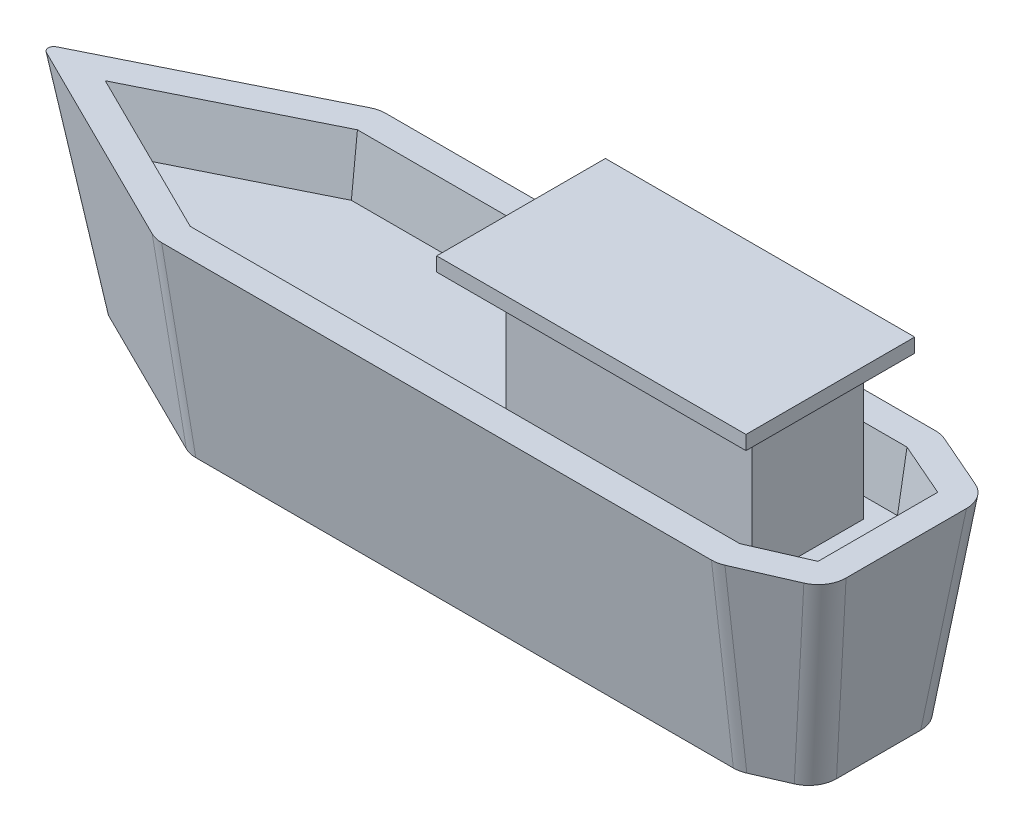
ISO-10303-21;
HEADER;
FILE_DESCRIPTION(('STEP AP214'),'2;1');
FILE_NAME('part.step','',(''),(''),'','','');
FILE_SCHEMA(('AUTOMOTIVE_DESIGN { 1 0 10303 214 1 1 1 1 }'));
ENDSEC;
DATA;
#1=APPLICATION_CONTEXT('core data for automotive mechanical design processes');
#2=APPLICATION_PROTOCOL_DEFINITION('international standard','automotive_design',2000,#1);
#3=PRODUCT_CONTEXT('',#1,'mechanical');
#4=PRODUCT('Part','Part','',(#3));
#5=PRODUCT_RELATED_PRODUCT_CATEGORY('part','',(#4));
#6=PRODUCT_DEFINITION_FORMATION('','',#4);
#7=PRODUCT_DEFINITION_CONTEXT('part definition',#1,'design');
#8=PRODUCT_DEFINITION('design','',#6,#7);
#9=PRODUCT_DEFINITION_SHAPE('','',#8);
#10=(LENGTH_UNIT() NAMED_UNIT(*) SI_UNIT(.MILLI.,.METRE.));
#11=(NAMED_UNIT(*) PLANE_ANGLE_UNIT() SI_UNIT($,.RADIAN.));
#12=(NAMED_UNIT(*) SI_UNIT($,.STERADIAN.) SOLID_ANGLE_UNIT());
#13=UNCERTAINTY_MEASURE_WITH_UNIT(LENGTH_MEASURE(1.E-05),#10,'distance_accuracy_value','');
#14=(GEOMETRIC_REPRESENTATION_CONTEXT(3) GLOBAL_UNCERTAINTY_ASSIGNED_CONTEXT((#13)) GLOBAL_UNIT_ASSIGNED_CONTEXT((#10,
#11,#12)) REPRESENTATION_CONTEXT('',''));
#15=CARTESIAN_POINT('',(0.,0.,0.));
#16=DIRECTION('',(0.,0.,1.));
#17=DIRECTION('',(1.,0.,0.));
#18=AXIS2_PLACEMENT_3D('',#15,#16,#17);
#19=CARTESIAN_POINT('',(0.,50.,0.));
#20=DIRECTION('',(0.,1.,0.));
#21=DIRECTION('',(0.,0.,1.));
#22=AXIS2_PLACEMENT_3D('',#19,#20,#21);
#23=PLANE('',#22);
#24=DIRECTION('',(-0.916515138991168,0.,-0.399999999999999));
#25=VECTOR('',#24,1.);
#26=CARTESIAN_POINT('',(94.7715064039731,50.,-28.0200161628074));
#27=LINE('',#26,#25);
#28=CARTESIAN_POINT('',(97.2718746178133,50.,-26.9287660099327));
#29=VERTEX_POINT('',#28);
#30=CARTESIAN_POINT('',(114.424220179668,50.,-19.4428686877196));
#31=VERTEX_POINT('',#30);
#32=EDGE_CURVE('E280',#29,#31,#27,.F.);
#33=ORIENTED_EDGE('',*,*,#32,.F.);
#34=DIRECTION('',(-1.,0.,0.));
#35=VECTOR('',#34,1.);
#36=CARTESIAN_POINT('',(100.,50.,-26.9287660099327));
#37=LINE('',#36,#35);
#38=CARTESIAN_POINT('',(-96.9356379014094,50.,-26.9287660099327));
#39=VERTEX_POINT('',#38);
#40=EDGE_CURVE('E306',#39,#29,#37,.F.);
#41=ORIENTED_EDGE('',*,*,#40,.F.);
#42=DIRECTION('',(-0.895806416477616,0.,0.444444444444446));
#43=VECTOR('',#42,1.);
#44=CARTESIAN_POINT('',(-94.1905626710812,50.,-28.2907047204174));
#45=LINE('',#44,#43);
#46=CARTESIAN_POINT('',(-151.212301005334,50.,0.));
#47=VERTEX_POINT('',#46);
#48=EDGE_CURVE('E301',#47,#39,#45,.F.);
#49=ORIENTED_EDGE('',*,*,#48,.F.);
#50=DIRECTION('',(0.895806416477617,0.,0.444444444444444));
#51=VECTOR('',#50,1.);
#52=CARTESIAN_POINT('',(-174.813140154067,50.,-11.7092952795825));
#53=LINE('',#52,#51);
#54=CARTESIAN_POINT('',(-96.9356379014094,50.,26.9287660099327));
#55=VERTEX_POINT('',#54);
#56=EDGE_CURVE('E296',#55,#47,#53,.F.);
#57=ORIENTED_EDGE('',*,*,#56,.F.);
#58=DIRECTION('',(1.,0.,0.));
#59=VECTOR('',#58,1.);
#60=CARTESIAN_POINT('',(100.,50.,26.9287660099327));
#61=LINE('',#60,#59);
#62=CARTESIAN_POINT('',(97.2718746178133,50.,26.9287660099327));
#63=VERTEX_POINT('',#62);
#64=EDGE_CURVE('E293',#63,#55,#61,.F.);
#65=ORIENTED_EDGE('',*,*,#64,.F.);
#66=DIRECTION('',(0.916515138991168,0.,-0.399999999999999));
#67=VECTOR('',#66,1.);
#68=CARTESIAN_POINT('',(122.266960573708,50.,16.0200161628074));
#69=LINE('',#68,#67);
#70=CARTESIAN_POINT('',(114.424220179668,50.,19.4428686877196));
#71=VERTEX_POINT('',#70);
#72=EDGE_CURVE('E290',#71,#63,#69,.F.);
#73=ORIENTED_EDGE('',*,*,#72,.F.);
#74=DIRECTION('',(0.,0.,-1.));
#75=VECTOR('',#74,1.);
#76=CARTESIAN_POINT('',(114.424220179668,50.,-28.));
#77=LINE('',#76,#75);
#78=EDGE_CURVE('E285',#31,#71,#77,.F.);
#79=ORIENTED_EDGE('',*,*,#78,.F.);
#80=EDGE_LOOP('',(#33,#41,#49,#57,#65,#73,#79));
#81=FACE_BOUND('',#80,.T.);
#82=DIRECTION('',(-1.,0.,0.));
#83=VECTOR('',#82,1.);
#84=CARTESIAN_POINT('',(0.,50.,19.8378584291667));
#85=LINE('',#84,#83);
#86=CARTESIAN_POINT('',(92.3333125989018,50.,19.8378584291667));
#87=VERTEX_POINT('',#86);
#88=CARTESIAN_POINT('',(4.74224105138959,50.,19.8378584291667));
#89=VERTEX_POINT('',#88);
#90=EDGE_CURVE('E373',#87,#89,#85,.T.);
#91=ORIENTED_EDGE('',*,*,#90,.T.);
#92=DIRECTION('',(0.,0.,-1.));
#93=VECTOR('',#92,1.);
#94=CARTESIAN_POINT('',(4.74224105138959,50.,0.));
#95=LINE('',#94,#93);
#96=CARTESIAN_POINT('',(4.74224105138959,50.,-19.8378584291667));
#97=VERTEX_POINT('',#96);
#98=EDGE_CURVE('E376',#89,#97,#95,.T.);
#99=ORIENTED_EDGE('',*,*,#98,.T.);
#100=DIRECTION('',(1.,0.,0.));
#101=VECTOR('',#100,1.);
#102=CARTESIAN_POINT('',(0.,50.,-19.8378584291667));
#103=LINE('',#102,#101);
#104=CARTESIAN_POINT('',(92.3333125989018,50.,-19.8378584291667));
#105=VERTEX_POINT('',#104);
#106=EDGE_CURVE('E367',#97,#105,#103,.T.);
#107=ORIENTED_EDGE('',*,*,#106,.T.);
#108=DIRECTION('',(0.,0.,1.));
#109=VECTOR('',#108,1.);
#110=CARTESIAN_POINT('',(92.3333125989018,50.,0.));
#111=LINE('',#110,#109);
#112=EDGE_CURVE('E370',#105,#87,#111,.T.);
#113=ORIENTED_EDGE('',*,*,#112,.T.);
#114=EDGE_LOOP('',(#91,#99,#107,#113));
#115=FACE_BOUND('',#114,.T.);
#116=ADVANCED_FACE('F35',(#81,#115),#23,.T.);
#117=CARTESIAN_POINT('',(0.,70.,0.));
#118=DIRECTION('',(0.,1.,0.));
#119=DIRECTION('',(0.,0.,1.));
#120=AXIS2_PLACEMENT_3D('',#117,#118,#119);
#121=PLANE('',#120);
#122=DIRECTION('',(-0.916515138991168,0.,0.399999999999999));
#123=VECTOR('',#122,1.);
#124=CARTESIAN_POINT('',(26.5600753054508,70.,60.856777775478));
#125=LINE('',#124,#123);
#126=CARTESIAN_POINT('',(97.858526220373,70.,29.7395827039805));
#127=VERTEX_POINT('',#126);
#128=CARTESIAN_POINT('',(117.235036873716,70.,21.2829801541652));
#129=VERTEX_POINT('',#128);
#130=EDGE_CURVE('E283',#127,#129,#125,.F.);
#131=ORIENTED_EDGE('',*,*,#130,.F.);
#132=DIRECTION('',(-1.,0.,0.));
#133=VECTOR('',#132,1.);
#134=CARTESIAN_POINT('',(0.,70.,29.7395827039805));
#135=LINE('',#134,#133);
#136=CARTESIAN_POINT('',(-97.5945932953585,70.,29.7395827039805));
#137=VERTEX_POINT('',#136);
#138=EDGE_CURVE('E279',#137,#127,#135,.F.);
#139=ORIENTED_EDGE('',*,*,#138,.F.);
#140=DIRECTION('',(-0.895806416477617,0.,-0.444444444444444));
#141=VECTOR('',#140,1.);
#142=CARTESIAN_POINT('',(-31.118348358902,70.,62.7210362927029));
#143=LINE('',#142,#141);
#144=CARTESIAN_POINT('',(-157.536638566942,70.,1.11556331639602E-13));
#145=VERTEX_POINT('',#144);
#146=EDGE_CURVE('E295',#145,#137,#143,.F.);
#147=ORIENTED_EDGE('',*,*,#146,.F.);
#148=DIRECTION('',(0.895806416477616,0.,-0.444444444444446));
#149=VECTOR('',#148,1.);
#150=CARTESIAN_POINT('',(-31.1183483589022,70.,-62.7210362927029));
#151=LINE('',#150,#149);
#152=CARTESIAN_POINT('',(-97.5945932953585,70.,-29.7395827039805));
#153=VERTEX_POINT('',#152);
#154=EDGE_CURVE('E299',#153,#145,#151,.F.);
#155=ORIENTED_EDGE('',*,*,#154,.F.);
#156=DIRECTION('',(1.,0.,0.));
#157=VECTOR('',#156,1.);
#158=CARTESIAN_POINT('',(0.,70.,-29.7395827039805));
#159=LINE('',#158,#157);
#160=CARTESIAN_POINT('',(97.858526220373,70.,-29.7395827039805));
#161=VERTEX_POINT('',#160);
#162=EDGE_CURVE('E304',#161,#153,#159,.F.);
#163=ORIENTED_EDGE('',*,*,#162,.F.);
#164=DIRECTION('',(0.916515138991168,0.,0.399999999999999));
#165=VECTOR('',#164,1.);
#166=CARTESIAN_POINT('',(26.5600753054508,70.,-60.856777775478));
#167=LINE('',#166,#165);
#168=CARTESIAN_POINT('',(117.235036873716,70.,-21.2829801541652));
#169=VERTEX_POINT('',#168);
#170=EDGE_CURVE('E309',#169,#161,#167,.F.);
#171=ORIENTED_EDGE('',*,*,#170,.F.);
#172=DIRECTION('',(0.,0.,1.));
#173=VECTOR('',#172,1.);
#174=CARTESIAN_POINT('',(117.235036873716,70.,0.));
#175=LINE('',#174,#173);
#176=EDGE_CURVE('E312',#129,#169,#175,.F.);
#177=ORIENTED_EDGE('',*,*,#176,.F.);
#178=EDGE_LOOP('',(#131,#139,#147,#155,#163,#171,#177));
#179=FACE_BOUND('',#178,.T.);
#180=DIRECTION('',(1.,0.,0.));
#181=VECTOR('',#180,1.);
#182=CARTESIAN_POINT('',(0.,70.,-39.8378584291667));
#183=LINE('',#182,#181);
#184=CARTESIAN_POINT('',(97.8993492817287,70.,-39.8378584291667));
#185=VERTEX_POINT('',#184);
#186=CARTESIAN_POINT('',(-97.6404477281436,70.,-39.8378584291667));
#187=VERTEX_POINT('',#186);
#188=EDGE_CURVE('E344',#185,#187,#183,.F.);
#189=ORIENTED_EDGE('',*,*,#188,.T.);
#190=CARTESIAN_POINT('',(-97.5945932953585,70.,-29.7395827039805));
#191=DIRECTION('',(0.,1.,0.));
#192=DIRECTION('',(0.228247216327367,0.,0.973603208827296));
#193=AXIS2_PLACEMENT_3D('',#190,#191,#192);
#194=ELLIPSE('',#193,10.1036492503792,10.);
#195=CARTESIAN_POINT('',(-102.041639144773,70.,-38.8060626418669));
#196=VERTEX_POINT('',#195);
#197=EDGE_CURVE('E435',#187,#196,#194,.T.);
#198=ORIENTED_EDGE('',*,*,#197,.T.);
#199=DIRECTION('',(0.895806416477616,0.,-0.444444444444446));
#200=VECTOR('',#199,1.);
#201=CARTESIAN_POINT('',(-35.6064709034294,70.,-71.7671364826848));
#202=LINE('',#201,#200);
#203=CARTESIAN_POINT('',(-176.681790922599,70.,-1.77417698002308));
#204=VERTEX_POINT('',#203);
#205=EDGE_CURVE('E339',#196,#204,#202,.F.);
#206=ORIENTED_EDGE('',*,*,#205,.T.);
#207=CARTESIAN_POINT('',(-175.713534872277,70.,1.32458697242392E-13));
#208=DIRECTION('',(0.,1.,0.));
#209=DIRECTION('',(1.,0.,0.));
#210=AXIS2_PLACEMENT_3D('',#207,#208,#209);
#211=ELLIPSE('',#210,2.09761113077033,2.);
#212=CARTESIAN_POINT('',(-176.681790922599,70.,1.77417698002333));
#213=VERTEX_POINT('',#212);
#214=EDGE_CURVE('E387',#204,#213,#211,.T.);
#215=ORIENTED_EDGE('',*,*,#214,.T.);
#216=DIRECTION('',(-0.895806416477617,0.,-0.444444444444444));
#217=VECTOR('',#216,1.);
#218=CARTESIAN_POINT('',(-35.6064709034291,70.,71.7671364826848));
#219=LINE('',#218,#217);
#220=CARTESIAN_POINT('',(-102.041639144773,70.,38.806062641867));
#221=VERTEX_POINT('',#220);
#222=EDGE_CURVE('E335',#213,#221,#219,.F.);
#223=ORIENTED_EDGE('',*,*,#222,.T.);
#224=CARTESIAN_POINT('',(-97.5945932953585,70.,29.7395827039805));
#225=DIRECTION('',(0.,1.,0.));
#226=DIRECTION('',(0.22824721632737,0.,-0.973603208827296));
#227=AXIS2_PLACEMENT_3D('',#224,#225,#226);
#228=ELLIPSE('',#227,10.1036492503792,10.);
#229=CARTESIAN_POINT('',(-97.6404477281436,70.,39.8378584291667));
#230=VERTEX_POINT('',#229);
#231=EDGE_CURVE('E50',#221,#230,#228,.T.);
#232=ORIENTED_EDGE('',*,*,#231,.T.);
#233=DIRECTION('',(-1.,0.,0.));
#234=VECTOR('',#233,1.);
#235=CARTESIAN_POINT('',(0.,70.,39.8378584291667));
#236=LINE('',#235,#234);
#237=CARTESIAN_POINT('',(97.8993492817287,70.,39.8378584291667));
#238=VERTEX_POINT('',#237);
#239=EDGE_CURVE('E320',#230,#238,#236,.F.);
#240=ORIENTED_EDGE('',*,*,#239,.T.);
#241=CARTESIAN_POINT('',(97.858526220373,70.,29.7395827039805));
#242=DIRECTION('',(0.,1.,0.));
#243=DIRECTION('',(0.204309643689222,0.,0.978906312930703));
#244=AXIS2_PLACEMENT_3D('',#241,#242,#243);
#245=ELLIPSE('',#244,10.1025349614629,10.);
#246=CARTESIAN_POINT('',(101.860421556695,70.,39.0111345083629));
#247=VERTEX_POINT('',#246);
#248=EDGE_CURVE('E405',#238,#247,#245,.T.);
#249=ORIENTED_EDGE('',*,*,#248,.T.);
#250=DIRECTION('',(-0.916515138991168,0.,0.399999999999999));
#251=VECTOR('',#250,1.);
#252=CARTESIAN_POINT('',(30.5993855955253,70.,70.1120003553181));
#253=LINE('',#252,#251);
#254=CARTESIAN_POINT('',(121.391704186452,70.,30.4869839302259));
#255=VERTEX_POINT('',#254);
#256=EDGE_CURVE('E355',#247,#255,#253,.F.);
#257=ORIENTED_EDGE('',*,*,#256,.T.);
#258=CARTESIAN_POINT('',(117.235036873716,70.,21.2829801541652));
#259=DIRECTION('',(0.,1.,0.));
#260=DIRECTION('',(0.836660026534075,0.,0.547722557505167));
#261=AXIS2_PLACEMENT_3D('',#258,#259,#260);
#262=ELLIPSE('',#261,10.1401023256238,10.);
#263=CARTESIAN_POINT('',(127.333312598902,70.,21.4110271636139));
#264=VERTEX_POINT('',#263);
#265=EDGE_CURVE('E407',#255,#264,#262,.T.);
#266=ORIENTED_EDGE('',*,*,#265,.T.);
#267=DIRECTION('',(0.,0.,1.));
#268=VECTOR('',#267,1.);
#269=CARTESIAN_POINT('',(127.333312598902,70.,0.));
#270=LINE('',#269,#268);
#271=CARTESIAN_POINT('',(127.333312598902,70.,-21.4110271636139));
#272=VERTEX_POINT('',#271);
#273=EDGE_CURVE('E361',#264,#272,#270,.F.);
#274=ORIENTED_EDGE('',*,*,#273,.T.);
#275=CARTESIAN_POINT('',(117.235036873716,70.,-21.2829801541652));
#276=DIRECTION('',(0.,1.,0.));
#277=DIRECTION('',(-0.836660026534075,0.,0.547722557505167));
#278=AXIS2_PLACEMENT_3D('',#275,#276,#277);
#279=ELLIPSE('',#278,10.1401023256238,10.);
#280=CARTESIAN_POINT('',(121.391704186452,70.,-30.4869839302259));
#281=VERTEX_POINT('',#280);
#282=EDGE_CURVE('E409',#272,#281,#279,.T.);
#283=ORIENTED_EDGE('',*,*,#282,.T.);
#284=DIRECTION('',(0.916515138991168,0.,0.399999999999999));
#285=VECTOR('',#284,1.);
#286=CARTESIAN_POINT('',(30.5993855955253,70.,-70.1120003553182));
#287=LINE('',#286,#285);
#288=CARTESIAN_POINT('',(101.860421556695,70.,-39.0111345083629));
#289=VERTEX_POINT('',#288);
#290=EDGE_CURVE('E349',#281,#289,#287,.F.);
#291=ORIENTED_EDGE('',*,*,#290,.T.);
#292=CARTESIAN_POINT('',(97.858526220373,70.,-29.7395827039805));
#293=DIRECTION('',(0.,1.,0.));
#294=DIRECTION('',(-0.204309643689221,0.,0.978906312930703));
#295=AXIS2_PLACEMENT_3D('',#292,#293,#294);
#296=ELLIPSE('',#295,10.1025349614629,10.);
#297=EDGE_CURVE('E411',#289,#185,#296,.T.);
#298=ORIENTED_EDGE('',*,*,#297,.T.);
#299=EDGE_LOOP('',(#189,#198,#206,#215,#223,#232,#240,#249,#257,#266,#274,#283,#291,#298));
#300=FACE_BOUND('',#299,.T.);
#301=ADVANCED_FACE('F452',(#179,#300),#121,.T.);
#302=CARTESIAN_POINT('',(0.,0.,0.));
#303=DIRECTION('',(0.,1.,0.));
#304=DIRECTION('',(0.,0.,1.));
#305=AXIS2_PLACEMENT_3D('',#302,#303,#304);
#306=PLANE('',#305);
#307=DIRECTION('',(0.895806416477616,0.,-0.444444444444446));
#308=VECTOR('',#307,1.);
#309=CARTESIAN_POINT('',(-31.2340893793551,0.,-62.9543197774385));
#310=LINE('',#309,#308);
#311=CARTESIAN_POINT('',(-154.546609456973,0.,-1.77417698002309));
#312=VERTEX_POINT('',#311);
#313=CARTESIAN_POINT('',(-99.735295265951,0.,-28.9682042126997));
#314=VERTEX_POINT('',#313);
#315=EDGE_CURVE('E341',#312,#314,#310,.T.);
#316=ORIENTED_EDGE('',*,*,#315,.T.);
#317=CARTESIAN_POINT('',(-95.2882494165367,0.,-19.9017242748133));
#318=DIRECTION('',(0.,1.,0.));
#319=DIRECTION('',(0.228247216327367,0.,0.973603208827296));
#320=AXIS2_PLACEMENT_3D('',#317,#318,#319);
#321=ELLIPSE('',#320,10.1036492503792,10.);
#322=CARTESIAN_POINT('',(-95.3341038493218,0.,-29.9999999999995));
#323=VERTEX_POINT('',#322);
#324=EDGE_CURVE('E430',#314,#323,#321,.F.);
#325=ORIENTED_EDGE('',*,*,#324,.T.);
#326=DIRECTION('',(1.,0.,0.));
#327=VECTOR('',#326,1.);
#328=CARTESIAN_POINT('',(0.,0.,-29.9999999999995));
#329=LINE('',#328,#327);
#330=CARTESIAN_POINT('',(95.8460686727697,0.,-29.9999999999995));
#331=VERTEX_POINT('',#330);
#332=EDGE_CURVE('E347',#323,#331,#329,.T.);
#333=ORIENTED_EDGE('',*,*,#332,.T.);
#334=CARTESIAN_POINT('',(95.805245611414,0.,-19.9017242748133));
#335=DIRECTION('',(0.,1.,0.));
#336=DIRECTION('',(-0.204309643689221,0.,0.978906312930703));
#337=AXIS2_PLACEMENT_3D('',#334,#335,#336);
#338=ELLIPSE('',#337,10.1025349614629,10.);
#339=CARTESIAN_POINT('',(99.807140947736,0.,-29.1732760791958));
#340=VERTEX_POINT('',#339);
#341=EDGE_CURVE('E398',#331,#340,#338,.F.);
#342=ORIENTED_EDGE('',*,*,#341,.T.);
#343=DIRECTION('',(0.916515138991168,0.,0.399999999999999));
#344=VECTOR('',#343,1.);
#345=CARTESIAN_POINT('',(26.6642422238584,0.,-61.0954541697346));
#346=LINE('',#345,#344);
#347=CARTESIAN_POINT('',(111.553845757285,0.,-24.0465937976662));
#348=VERTEX_POINT('',#347);
#349=EDGE_CURVE('E352',#340,#348,#346,.T.);
#350=ORIENTED_EDGE('',*,*,#349,.T.);
#351=CARTESIAN_POINT('',(107.397178444548,0.,-14.8425900216055));
#352=DIRECTION('',(0.,1.,0.));
#353=DIRECTION('',(-0.836660026534075,0.,0.547722557505167));
#354=AXIS2_PLACEMENT_3D('',#351,#352,#353);
#355=ELLIPSE('',#354,10.1401023256238,10.);
#356=CARTESIAN_POINT('',(117.495454169735,0.,-14.9706370310542));
#357=VERTEX_POINT('',#356);
#358=EDGE_CURVE('E396',#348,#357,#355,.F.);
#359=ORIENTED_EDGE('',*,*,#358,.T.);
#360=DIRECTION('',(0.,0.,1.));
#361=VECTOR('',#360,1.);
#362=CARTESIAN_POINT('',(117.495454169735,0.,0.));
#363=LINE('',#362,#361);
#364=CARTESIAN_POINT('',(117.495454169735,0.,14.9706370310542));
#365=VERTEX_POINT('',#364);
#366=EDGE_CURVE('E364',#357,#365,#363,.T.);
#367=ORIENTED_EDGE('',*,*,#366,.T.);
#368=CARTESIAN_POINT('',(107.397178444548,0.,14.8425900216055));
#369=DIRECTION('',(0.,1.,0.));
#370=DIRECTION('',(0.836660026534075,0.,0.547722557505167));
#371=AXIS2_PLACEMENT_3D('',#368,#369,#370);
#372=ELLIPSE('',#371,10.1401023256238,10.);
#373=CARTESIAN_POINT('',(111.553845757285,0.,24.0465937976661));
#374=VERTEX_POINT('',#373);
#375=EDGE_CURVE('E394',#365,#374,#372,.F.);
#376=ORIENTED_EDGE('',*,*,#375,.T.);
#377=DIRECTION('',(-0.916515138991168,0.,0.399999999999999));
#378=VECTOR('',#377,1.);
#379=CARTESIAN_POINT('',(26.6642422238584,0.,61.0954541697345));
#380=LINE('',#379,#378);
#381=CARTESIAN_POINT('',(99.807140947736,0.,29.1732760791957));
#382=VERTEX_POINT('',#381);
#383=EDGE_CURVE('E358',#374,#382,#380,.T.);
#384=ORIENTED_EDGE('',*,*,#383,.T.);
#385=CARTESIAN_POINT('',(95.805245611414,0.,19.9017242748133));
#386=DIRECTION('',(0.,1.,0.));
#387=DIRECTION('',(0.204309643689222,0.,0.978906312930703));
#388=AXIS2_PLACEMENT_3D('',#385,#386,#387);
#389=ELLIPSE('',#388,10.1025349614629,10.);
#390=CARTESIAN_POINT('',(95.8460686727697,0.,29.9999999999995));
#391=VERTEX_POINT('',#390);
#392=EDGE_CURVE('E392',#382,#391,#389,.F.);
#393=ORIENTED_EDGE('',*,*,#392,.T.);
#394=DIRECTION('',(-1.,0.,0.));
#395=VECTOR('',#394,1.);
#396=CARTESIAN_POINT('',(0.,0.,29.9999999999995));
#397=LINE('',#396,#395);
#398=CARTESIAN_POINT('',(-95.3341038493218,0.,29.9999999999995));
#399=VERTEX_POINT('',#398);
#400=EDGE_CURVE('E332',#391,#399,#397,.T.);
#401=ORIENTED_EDGE('',*,*,#400,.T.);
#402=CARTESIAN_POINT('',(-95.2882494165366,0.,19.9017242748133));
#403=DIRECTION('',(0.,1.,0.));
#404=DIRECTION('',(0.22824721632737,0.,-0.973603208827296));
#405=AXIS2_PLACEMENT_3D('',#402,#403,#404);
#406=ELLIPSE('',#405,10.1036492503792,10.);
#407=CARTESIAN_POINT('',(-99.735295265951,0.,28.9682042126998));
#408=VERTEX_POINT('',#407);
#409=EDGE_CURVE('E428',#399,#408,#406,.F.);
#410=ORIENTED_EDGE('',*,*,#409,.T.);
#411=DIRECTION('',(-0.895806416477617,0.,-0.444444444444444));
#412=VECTOR('',#411,1.);
#413=CARTESIAN_POINT('',(-31.2340893793548,0.,62.9543197774384));
#414=LINE('',#413,#412);
#415=CARTESIAN_POINT('',(-154.546609456973,0.,1.77417698002328));
#416=VERTEX_POINT('',#415);
#417=EDGE_CURVE('E337',#408,#416,#414,.T.);
#418=ORIENTED_EDGE('',*,*,#417,.T.);
#419=CARTESIAN_POINT('',(-153.578353406651,0.,0.));
#420=DIRECTION('',(0.,1.,0.));
#421=DIRECTION('',(1.,0.,0.));
#422=AXIS2_PLACEMENT_3D('',#419,#420,#421);
#423=ELLIPSE('',#422,2.09761113077033,2.);
#424=EDGE_CURVE('E382',#416,#312,#423,.F.);
#425=ORIENTED_EDGE('',*,*,#424,.T.);
#426=EDGE_LOOP('',(#316,#325,#333,#342,#350,#359,#367,#376,#384,#393,#401,#410,#418,#425));
#427=FACE_BOUND('',#426,.T.);
#428=ADVANCED_FACE('F444',(#427),#306,.F.);
#429=CARTESIAN_POINT('',(100.,71.1536972238474,40.));
#430=DIRECTION('',(0.,0.139173100960062,-0.990268068741571));
#431=DIRECTION('',(1.,0.,0.));
#432=AXIS2_PLACEMENT_3D('',#429,#430,#431);
#433=PLANE('',#432);
#434=ORIENTED_EDGE('',*,*,#239,.F.);
#435=DIRECTION('',(-0.0326097718566574,0.989741404535069,0.139099083132873));
#436=VECTOR('',#435,1.);
#437=CARTESIAN_POINT('',(-97.4682487542048,64.7735772247986,39.1033326098323));
#438=LINE('',#437,#436);
#439=EDGE_CURVE('E43',#230,#399,#438,.F.);
#440=ORIENTED_EDGE('',*,*,#439,.T.);
#441=ORIENTED_EDGE('',*,*,#400,.F.);
#442=DIRECTION('',(-0.0290348711881498,-0.989850570984999,-0.139114425476867));
#443=VECTOR('',#442,1.);
#444=CARTESIAN_POINT('',(97.93493256773,71.2130977174865,40.0083481949578));
#445=LINE('',#444,#443);
#446=EDGE_CURVE('E422',#391,#238,#445,.F.);
#447=ORIENTED_EDGE('',*,*,#446,.T.);
#448=EDGE_LOOP('',(#434,#440,#441,#447));
#449=FACE_BOUND('',#448,.T.);
#450=ADVANCED_FACE('F440',(#449),#433,.F.);
#451=CARTESIAN_POINT('',(-180.622577482985,71.1536972238474,1.38777878078145E-13));
#452=DIRECTION('',(0.440119141662919,0.139173100960062,-0.887088490011597));
#453=DIRECTION('',(0.895806416477617,0.,0.444444444444444));
#454=AXIS2_PLACEMENT_3D('',#451,#452,#453);
#455=PLANE('',#454);
#456=ORIENTED_EDGE('',*,*,#417,.F.);
#457=DIRECTION('',(-0.0326097718566573,0.989741404535069,0.139099083132873));
#458=VECTOR('',#457,1.);
#459=CARTESIAN_POINT('',(-101.986413865094,68.3238537786861,38.5704956528402));
#460=LINE('',#459,#458);
#461=EDGE_CURVE('E11',#408,#221,#460,.T.);
#462=ORIENTED_EDGE('',*,*,#461,.T.);
#463=ORIENTED_EDGE('',*,*,#222,.F.);
#464=DIRECTION('',(-0.30150190704246,0.95346557360492,0.));
#465=VECTOR('',#464,1.);
#466=CARTESIAN_POINT('',(-177.371677108652,72.1816867911694,1.77417698002332));
#467=LINE('',#466,#465);
#468=EDGE_CURVE('E379',#213,#416,#467,.F.);
#469=ORIENTED_EDGE('',*,*,#468,.T.);
#470=EDGE_LOOP('',(#456,#462,#463,#469));
#471=FACE_BOUND('',#470,.T.);
#472=ADVANCED_FACE('F498',(#471),#455,.F.);
#473=CARTESIAN_POINT('',(-100.,71.1536972238474,-40.));
#474=DIRECTION('',(0.440119141662922,0.139173100960062,0.887088490011596));
#475=DIRECTION('',(-0.895806416477616,0.,0.444444444444446));
#476=AXIS2_PLACEMENT_3D('',#473,#474,#475);
#477=PLANE('',#476);
#478=ORIENTED_EDGE('',*,*,#205,.F.);
#479=DIRECTION('',(-0.0326097718566569,0.989741404535069,-0.139099083132873));
#480=VECTOR('',#479,1.);
#481=CARTESIAN_POINT('',(-102.082119614943,71.2286255045939,-38.9787346958192));
#482=LINE('',#481,#480);
#483=EDGE_CURVE('E425',#196,#314,#482,.F.);
#484=ORIENTED_EDGE('',*,*,#483,.T.);
#485=ORIENTED_EDGE('',*,*,#315,.F.);
#486=DIRECTION('',(-0.30150190704246,0.95346557360492,0.));
#487=VECTOR('',#486,1.);
#488=CARTESIAN_POINT('',(-170.042810702697,49.004978291466,-1.77417698002307));
#489=LINE('',#488,#487);
#490=EDGE_CURVE('E384',#312,#204,#489,.T.);
#491=ORIENTED_EDGE('',*,*,#490,.T.);
#492=EDGE_LOOP('',(#478,#484,#485,#491));
#493=FACE_BOUND('',#492,.T.);
#494=ADVANCED_FACE('F490',(#493),#477,.F.);
#495=CARTESIAN_POINT('',(100.,71.1536972238474,-40.));
#496=DIRECTION('',(0.,0.139173100960062,0.990268068741571));
#497=DIRECTION('',(-1.,0.,0.));
#498=AXIS2_PLACEMENT_3D('',#495,#496,#497);
#499=PLANE('',#498);
#500=ORIENTED_EDGE('',*,*,#332,.F.);
#501=DIRECTION('',(-0.0326097718566568,0.989741404535069,-0.139099083132873));
#502=VECTOR('',#501,1.);
#503=CARTESIAN_POINT('',(-97.4682487542047,64.7735772247987,-39.1033326098323));
#504=LINE('',#503,#502);
#505=EDGE_CURVE('E432',#323,#187,#504,.T.);
#506=ORIENTED_EDGE('',*,*,#505,.T.);
#507=ORIENTED_EDGE('',*,*,#188,.F.);
#508=DIRECTION('',(0.0290348711881497,0.989850570984999,-0.139114425476867));
#509=VECTOR('',#508,1.);
#510=CARTESIAN_POINT('',(97.93493256773,71.2130977174865,-40.0083481949578));
#511=LINE('',#510,#509);
#512=EDGE_CURVE('E389',#185,#331,#511,.F.);
#513=ORIENTED_EDGE('',*,*,#512,.T.);
#514=EDGE_LOOP('',(#500,#506,#507,#513));
#515=FACE_BOUND('',#514,.T.);
#516=ADVANCED_FACE('F483',(#515),#499,.F.);
#517=CARTESIAN_POINT('',(100.,71.1536972238474,-40.));
#518=DIRECTION('',(-0.396107227496628,0.139173100960062,0.907595676661197));
#519=DIRECTION('',(-0.916515138991168,0.,-0.399999999999999));
#520=AXIS2_PLACEMENT_3D('',#517,#518,#519);
#521=PLANE('',#520);
#522=ORIENTED_EDGE('',*,*,#349,.F.);
#523=DIRECTION('',(0.0290348711881496,0.989850570984999,-0.139114425476867));
#524=VECTOR('',#523,1.);
#525=CARTESIAN_POINT('',(101.896004842696,71.2130977174865,-39.181624274154));
#526=LINE('',#525,#524);
#527=EDGE_CURVE('E403',#340,#289,#526,.T.);
#528=ORIENTED_EDGE('',*,*,#527,.T.);
#529=ORIENTED_EDGE('',*,*,#290,.F.);
#530=DIRECTION('',(0.138599030058351,0.986183342029031,-0.0907343637842647));
#531=VECTOR('',#530,1.);
#532=CARTESIAN_POINT('',(121.25810095748,69.0493636297558,-30.3995200859605));
#533=LINE('',#532,#531);
#534=EDGE_CURVE('E400',#281,#348,#533,.F.);
#535=ORIENTED_EDGE('',*,*,#534,.T.);
#536=EDGE_LOOP('',(#522,#528,#529,#535));
#537=FACE_BOUND('',#536,.T.);
#538=ADVANCED_FACE('F473',(#537),#521,.F.);
#539=CARTESIAN_POINT('',(127.495454169735,71.1536972238474,28.));
#540=DIRECTION('',(-0.396107227496628,0.139173100960062,-0.907595676661197));
#541=DIRECTION('',(0.916515138991168,0.,-0.399999999999999));
#542=AXIS2_PLACEMENT_3D('',#539,#540,#541);
#543=PLANE('',#542);
#544=ORIENTED_EDGE('',*,*,#383,.F.);
#545=DIRECTION('',(-0.138599030058351,-0.986183342029031,-0.0907343637842647));
#546=VECTOR('',#545,1.);
#547=CARTESIAN_POINT('',(121.635371801884,71.7337851731651,30.6465018291006));
#548=LINE('',#547,#546);
#549=EDGE_CURVE('E419',#374,#255,#548,.F.);
#550=ORIENTED_EDGE('',*,*,#549,.T.);
#551=ORIENTED_EDGE('',*,*,#256,.F.);
#552=DIRECTION('',(-0.0290348711881498,-0.989850570984999,-0.139114425476867));
#553=VECTOR('',#552,1.);
#554=CARTESIAN_POINT('',(101.870714130349,70.3508922027646,39.06044919143));
#555=LINE('',#554,#553);
#556=EDGE_CURVE('E417',#247,#382,#555,.T.);
#557=ORIENTED_EDGE('',*,*,#556,.T.);
#558=EDGE_LOOP('',(#544,#550,#551,#557));
#559=FACE_BOUND('',#558,.T.);
#560=ADVANCED_FACE('F454',(#559),#543,.F.);
#561=CARTESIAN_POINT('',(127.495454169735,71.1536972238474,-28.));
#562=DIRECTION('',(-0.990268068741571,0.139173100960062,0.));
#563=DIRECTION('',(0.,0.,-1.));
#564=AXIS2_PLACEMENT_3D('',#561,#562,#563);
#565=PLANE('',#564);
#566=ORIENTED_EDGE('',*,*,#366,.F.);
#567=DIRECTION('',(0.138599030058351,0.986183342029031,-0.0907343637842647));
#568=VECTOR('',#567,1.);
#569=CARTESIAN_POINT('',(127.576980214333,71.7337851731651,-21.5705450624886));
#570=LINE('',#569,#568);
#571=EDGE_CURVE('E415',#357,#272,#570,.T.);
#572=ORIENTED_EDGE('',*,*,#571,.T.);
#573=ORIENTED_EDGE('',*,*,#273,.F.);
#574=DIRECTION('',(-0.138599030058351,-0.986183342029031,-0.0907343637842647));
#575=VECTOR('',#574,1.);
#576=CARTESIAN_POINT('',(126.872741304779,66.722864958801,21.1095124752938));
#577=LINE('',#576,#575);
#578=EDGE_CURVE('E413',#264,#365,#577,.T.);
#579=ORIENTED_EDGE('',*,*,#578,.T.);
#580=EDGE_LOOP('',(#566,#572,#573,#579));
#581=FACE_BOUND('',#580,.T.);
#582=ADVANCED_FACE('F464',(#581),#565,.F.);
#583=CARTESIAN_POINT('',(100.,72.545428233448,30.0973193125843));
#584=DIRECTION('',(0.,0.139173100960062,-0.990268068741571));
#585=DIRECTION('',(1.,0.,0.));
#586=AXIS2_PLACEMENT_3D('',#583,#584,#585);
#587=PLANE('',#586);
#588=ORIENTED_EDGE('',*,*,#64,.T.);
#589=DIRECTION('',(0.0326097718566574,-0.989741404535069,-0.139099083132873));
#590=VECTOR('',#589,1.);
#591=CARTESIAN_POINT('',(-97.4682487542048,66.1653082343992,29.2006519224166));
#592=LINE('',#591,#590);
#593=EDGE_CURVE('E300',#137,#55,#592,.T.);
#594=ORIENTED_EDGE('',*,*,#593,.F.);
#595=ORIENTED_EDGE('',*,*,#138,.T.);
#596=DIRECTION('',(0.0290348711881498,0.989850570984999,0.139114425476867));
#597=VECTOR('',#596,1.);
#598=CARTESIAN_POINT('',(97.93493256773,72.6048287270871,30.1056675075421));
#599=LINE('',#598,#597);
#600=EDGE_CURVE('E292',#63,#127,#599,.T.);
#601=ORIENTED_EDGE('',*,*,#600,.F.);
#602=EDGE_LOOP('',(#588,#594,#595,#601));
#603=FACE_BOUND('',#602,.T.);
#604=ADVANCED_FACE('F517',(#603),#587,.T.);
#605=CARTESIAN_POINT('',(-176.221386066356,72.545428233448,-8.87088490011583));
#606=DIRECTION('',(0.440119141662919,0.139173100960062,-0.887088490011597));
#607=DIRECTION('',(0.895806416477617,0.,0.444444444444444));
#608=AXIS2_PLACEMENT_3D('',#605,#606,#607);
#609=PLANE('',#608);
#610=ORIENTED_EDGE('',*,*,#146,.T.);
#611=ORIENTED_EDGE('',*,*,#593,.T.);
#612=ORIENTED_EDGE('',*,*,#56,.T.);
#613=DIRECTION('',(0.30150190704246,-0.95346557360492,0.));
#614=VECTOR('',#613,1.);
#615=CARTESIAN_POINT('',(-159.966884194689,77.6853760700582,1.16226472890446E-13));
#616=LINE('',#615,#614);
#617=EDGE_CURVE('E305',#145,#47,#616,.T.);
#618=ORIENTED_EDGE('',*,*,#617,.F.);
#619=EDGE_LOOP('',(#610,#611,#612,#618));
#620=FACE_BOUND('',#619,.T.);
#621=ADVANCED_FACE('F520',(#620),#609,.T.);
#622=CARTESIAN_POINT('',(-95.5988085833708,72.545428233448,-31.129115099884));
#623=DIRECTION('',(0.440119141662922,0.139173100960062,0.887088490011596));
#624=DIRECTION('',(-0.895806416477616,0.,0.444444444444446));
#625=AXIS2_PLACEMENT_3D('',#622,#623,#624);
#626=PLANE('',#625);
#627=ORIENTED_EDGE('',*,*,#154,.T.);
#628=ORIENTED_EDGE('',*,*,#617,.T.);
#629=ORIENTED_EDGE('',*,*,#48,.T.);
#630=DIRECTION('',(0.0326097718566568,-0.989741404535069,0.139099083132873));
#631=VECTOR('',#630,1.);
#632=CARTESIAN_POINT('',(-97.6809281983134,72.6203565141945,-30.1078497957032));
#633=LINE('',#632,#631);
#634=EDGE_CURVE('E310',#153,#39,#633,.T.);
#635=ORIENTED_EDGE('',*,*,#634,.F.);
#636=EDGE_LOOP('',(#627,#628,#629,#635));
#637=FACE_BOUND('',#636,.T.);
#638=ADVANCED_FACE('F524',(#637),#626,.T.);
#639=CARTESIAN_POINT('',(100.,72.545428233448,-30.0973193125843));
#640=DIRECTION('',(0.,0.139173100960062,0.990268068741571));
#641=DIRECTION('',(-1.,0.,0.));
#642=AXIS2_PLACEMENT_3D('',#639,#640,#641);
#643=PLANE('',#642);
#644=ORIENTED_EDGE('',*,*,#162,.T.);
#645=ORIENTED_EDGE('',*,*,#634,.T.);
#646=ORIENTED_EDGE('',*,*,#40,.T.);
#647=DIRECTION('',(-0.0290348711881496,-0.989850570984999,0.139114425476867));
#648=VECTOR('',#647,1.);
#649=CARTESIAN_POINT('',(97.93493256773,72.6048287270871,-30.1056675075421));
#650=LINE('',#649,#648);
#651=EDGE_CURVE('E284',#161,#29,#650,.T.);
#652=ORIENTED_EDGE('',*,*,#651,.F.);
#653=EDGE_LOOP('',(#644,#645,#646,#652));
#654=FACE_BOUND('',#653,.T.);
#655=ADVANCED_FACE('F528',(#654),#643,.T.);
#656=CARTESIAN_POINT('',(96.0389277250337,72.545428233448,-30.924043233388));
#657=DIRECTION('',(-0.396107227496628,0.139173100960062,0.907595676661197));
#658=DIRECTION('',(-0.916515138991168,0.,-0.399999999999999));
#659=AXIS2_PLACEMENT_3D('',#656,#657,#658);
#660=PLANE('',#659);
#661=ORIENTED_EDGE('',*,*,#170,.T.);
#662=ORIENTED_EDGE('',*,*,#651,.T.);
#663=ORIENTED_EDGE('',*,*,#32,.T.);
#664=DIRECTION('',(-0.138599030058351,-0.986183342029031,0.0907343637842647));
#665=VECTOR('',#664,1.);
#666=CARTESIAN_POINT('',(117.297028682514,70.4410946393564,-21.3235633193486));
#667=LINE('',#666,#665);
#668=EDGE_CURVE('E289',#169,#31,#667,.T.);
#669=ORIENTED_EDGE('',*,*,#668,.F.);
#670=EDGE_LOOP('',(#661,#662,#663,#669));
#671=FACE_BOUND('',#670,.T.);
#672=ADVANCED_FACE('F532',(#671),#660,.T.);
#673=CARTESIAN_POINT('',(123.534381894769,72.545428233448,18.924043233388));
#674=DIRECTION('',(-0.396107227496628,0.139173100960062,-0.907595676661197));
#675=DIRECTION('',(0.916515138991168,0.,-0.399999999999999));
#676=AXIS2_PLACEMENT_3D('',#673,#674,#675);
#677=PLANE('',#676);
#678=ORIENTED_EDGE('',*,*,#72,.T.);
#679=ORIENTED_EDGE('',*,*,#600,.T.);
#680=ORIENTED_EDGE('',*,*,#130,.T.);
#681=DIRECTION('',(0.138599030058351,0.986183342029031,0.0907343637842647));
#682=VECTOR('',#681,1.);
#683=CARTESIAN_POINT('',(117.674299526917,73.1255161827657,21.5705450624886));
#684=LINE('',#683,#682);
#685=EDGE_CURVE('E288',#71,#129,#684,.T.);
#686=ORIENTED_EDGE('',*,*,#685,.F.);
#687=EDGE_LOOP('',(#678,#679,#680,#686));
#688=FACE_BOUND('',#687,.T.);
#689=ADVANCED_FACE('F536',(#688),#677,.T.);
#690=CARTESIAN_POINT('',(117.592773482319,72.545428233448,-28.));
#691=DIRECTION('',(-0.990268068741571,0.139173100960062,0.));
#692=DIRECTION('',(0.,0.,-1.));
#693=AXIS2_PLACEMENT_3D('',#690,#691,#692);
#694=PLANE('',#693);
#695=ORIENTED_EDGE('',*,*,#685,.T.);
#696=ORIENTED_EDGE('',*,*,#176,.T.);
#697=ORIENTED_EDGE('',*,*,#668,.T.);
#698=ORIENTED_EDGE('',*,*,#78,.T.);
#699=EDGE_LOOP('',(#695,#696,#697,#698));
#700=FACE_BOUND('',#699,.T.);
#701=ADVANCED_FACE('F540',(#700),#694,.T.);
#702=CARTESIAN_POINT('',(4.74224105138959,100.,-19.8378584291667));
#703=DIRECTION('',(1.,0.,0.));
#704=DIRECTION('',(0.,0.,-1.));
#705=AXIS2_PLACEMENT_3D('',#702,#703,#704);
#706=PLANE('',#705);
#707=ORIENTED_EDGE('',*,*,#98,.F.);
#708=DIRECTION('',(0.,-1.,0.));
#709=VECTOR('',#708,1.);
#710=CARTESIAN_POINT('',(4.74224105138959,100.,19.8378584291667));
#711=LINE('',#710,#709);
#712=CARTESIAN_POINT('',(4.74224105138959,100.,19.8378584291667));
#713=VERTEX_POINT('',#712);
#714=EDGE_CURVE('E276',#713,#89,#711,.T.);
#715=ORIENTED_EDGE('',*,*,#714,.F.);
#716=DIRECTION('',(0.,0.,1.));
#717=VECTOR('',#716,1.);
#718=CARTESIAN_POINT('',(4.74224105138959,100.,-19.8378584291667));
#719=LINE('',#718,#717);
#720=CARTESIAN_POINT('',(4.74224105138959,100.,-19.8378584291667));
#721=VERTEX_POINT('',#720);
#722=EDGE_CURVE('E251',#721,#713,#719,.T.);
#723=ORIENTED_EDGE('',*,*,#722,.F.);
#724=DIRECTION('',(0.,-1.,0.));
#725=VECTOR('',#724,1.);
#726=CARTESIAN_POINT('',(4.74224105138959,100.,-19.8378584291667));
#727=LINE('',#726,#725);
#728=EDGE_CURVE('E268',#721,#97,#727,.T.);
#729=ORIENTED_EDGE('',*,*,#728,.T.);
#730=EDGE_LOOP('',(#707,#715,#723,#729));
#731=FACE_BOUND('',#730,.T.);
#732=ADVANCED_FACE('F515',(#731),#706,.F.);
#733=CARTESIAN_POINT('',(4.74224105138959,100.,19.8378584291667));
#734=DIRECTION('',(0.,0.,-1.));
#735=DIRECTION('',(-1.,0.,0.));
#736=AXIS2_PLACEMENT_3D('',#733,#734,#735);
#737=PLANE('',#736);
#738=ORIENTED_EDGE('',*,*,#90,.F.);
#739=DIRECTION('',(0.,-1.,0.));
#740=VECTOR('',#739,1.);
#741=CARTESIAN_POINT('',(92.3333125989018,100.,19.8378584291667));
#742=LINE('',#741,#740);
#743=CARTESIAN_POINT('',(92.3333125989018,100.,19.8378584291667));
#744=VERTEX_POINT('',#743);
#745=EDGE_CURVE('E273',#744,#87,#742,.T.);
#746=ORIENTED_EDGE('',*,*,#745,.F.);
#747=DIRECTION('',(1.,0.,0.));
#748=VECTOR('',#747,1.);
#749=CARTESIAN_POINT('',(4.74224105138959,100.,19.8378584291667));
#750=LINE('',#749,#748);
#751=EDGE_CURVE('E254',#713,#744,#750,.T.);
#752=ORIENTED_EDGE('',*,*,#751,.F.);
#753=ORIENTED_EDGE('',*,*,#714,.T.);
#754=EDGE_LOOP('',(#738,#746,#752,#753));
#755=FACE_BOUND('',#754,.T.);
#756=ADVANCED_FACE('F669',(#755),#737,.F.);
#757=CARTESIAN_POINT('',(92.3333125989018,100.,-19.8378584291667));
#758=DIRECTION('',(-1.,0.,0.));
#759=DIRECTION('',(0.,0.,1.));
#760=AXIS2_PLACEMENT_3D('',#757,#758,#759);
#761=PLANE('',#760);
#762=ORIENTED_EDGE('',*,*,#112,.F.);
#763=DIRECTION('',(0.,-1.,0.));
#764=VECTOR('',#763,1.);
#765=CARTESIAN_POINT('',(92.3333125989018,100.,-19.8378584291667));
#766=LINE('',#765,#764);
#767=CARTESIAN_POINT('',(92.3333125989018,100.,-19.8378584291667));
#768=VERTEX_POINT('',#767);
#769=EDGE_CURVE('E271',#768,#105,#766,.T.);
#770=ORIENTED_EDGE('',*,*,#769,.F.);
#771=DIRECTION('',(0.,0.,-1.));
#772=VECTOR('',#771,1.);
#773=CARTESIAN_POINT('',(92.3333125989018,100.,-19.8378584291667));
#774=LINE('',#773,#772);
#775=EDGE_CURVE('E262',#744,#768,#774,.T.);
#776=ORIENTED_EDGE('',*,*,#775,.F.);
#777=ORIENTED_EDGE('',*,*,#745,.T.);
#778=EDGE_LOOP('',(#762,#770,#776,#777));
#779=FACE_BOUND('',#778,.T.);
#780=ADVANCED_FACE('F676',(#779),#761,.F.);
#781=CARTESIAN_POINT('',(4.74224105138959,100.,-19.8378584291667));
#782=DIRECTION('',(0.,0.,1.));
#783=DIRECTION('',(1.,0.,0.));
#784=AXIS2_PLACEMENT_3D('',#781,#782,#783);
#785=PLANE('',#784);
#786=ORIENTED_EDGE('',*,*,#106,.F.);
#787=ORIENTED_EDGE('',*,*,#728,.F.);
#788=DIRECTION('',(-1.,0.,0.));
#789=VECTOR('',#788,1.);
#790=CARTESIAN_POINT('',(4.74224105138959,100.,-19.8378584291667));
#791=LINE('',#790,#789);
#792=EDGE_CURVE('E265',#768,#721,#791,.T.);
#793=ORIENTED_EDGE('',*,*,#792,.F.);
#794=ORIENTED_EDGE('',*,*,#769,.T.);
#795=EDGE_LOOP('',(#786,#787,#793,#794));
#796=FACE_BOUND('',#795,.T.);
#797=ADVANCED_FACE('F683',(#796),#785,.F.);
#798=CARTESIAN_POINT('',(-9.66668740109827,105.,30.));
#799=DIRECTION('',(1.,0.,0.));
#800=DIRECTION('',(0.,0.,-1.));
#801=AXIS2_PLACEMENT_3D('',#798,#799,#800);
#802=PLANE('',#801);
#803=DIRECTION('',(0.,0.,1.));
#804=VECTOR('',#803,1.);
#805=CARTESIAN_POINT('',(-9.66668740109827,100.,30.));
#806=LINE('',#805,#804);
#807=CARTESIAN_POINT('',(-9.66668740109827,100.,-30.));
#808=VERTEX_POINT('',#807);
#809=CARTESIAN_POINT('',(-9.66668740109827,100.,30.));
#810=VERTEX_POINT('',#809);
#811=EDGE_CURVE('E250',#808,#810,#806,.T.);
#812=ORIENTED_EDGE('',*,*,#811,.T.);
#813=DIRECTION('',(0.,-1.,0.));
#814=VECTOR('',#813,1.);
#815=CARTESIAN_POINT('',(-9.66668740109827,105.,30.));
#816=LINE('',#815,#814);
#817=CARTESIAN_POINT('',(-9.66668740109827,105.,30.));
#818=VERTEX_POINT('',#817);
#819=EDGE_CURVE('E230',#818,#810,#816,.T.);
#820=ORIENTED_EDGE('',*,*,#819,.F.);
#821=DIRECTION('',(0.,0.,1.));
#822=VECTOR('',#821,1.);
#823=CARTESIAN_POINT('',(-9.66668740109827,105.,30.));
#824=LINE('',#823,#822);
#825=CARTESIAN_POINT('',(-9.66668740109827,105.,-30.));
#826=VERTEX_POINT('',#825);
#827=EDGE_CURVE('E237',#826,#818,#824,.T.);
#828=ORIENTED_EDGE('',*,*,#827,.F.);
#829=DIRECTION('',(0.,-1.,0.));
#830=VECTOR('',#829,1.);
#831=CARTESIAN_POINT('',(-9.66668740109827,105.,-30.));
#832=LINE('',#831,#830);
#833=EDGE_CURVE('E814',#826,#808,#832,.T.);
#834=ORIENTED_EDGE('',*,*,#833,.T.);
#835=EDGE_LOOP('',(#812,#820,#828,#834));
#836=FACE_BOUND('',#835,.T.);
#837=ADVANCED_FACE('F248',(#836),#802,.F.);
#838=CARTESIAN_POINT('',(-9.66668740109827,105.,30.));
#839=DIRECTION('',(0.,0.,-1.));
#840=DIRECTION('',(-1.,0.,0.));
#841=AXIS2_PLACEMENT_3D('',#838,#839,#840);
#842=PLANE('',#841);
#843=DIRECTION('',(1.,0.,0.));
#844=VECTOR('',#843,1.);
#845=CARTESIAN_POINT('',(-9.66668740109827,100.,30.));
#846=LINE('',#845,#844);
#847=CARTESIAN_POINT('',(100.333312598902,100.,30.));
#848=VERTEX_POINT('',#847);
#849=EDGE_CURVE('E805',#810,#848,#846,.T.);
#850=ORIENTED_EDGE('',*,*,#849,.T.);
#851=DIRECTION('',(0.,-1.,0.));
#852=VECTOR('',#851,1.);
#853=CARTESIAN_POINT('',(100.333312598902,105.,30.));
#854=LINE('',#853,#852);
#855=CARTESIAN_POINT('',(100.333312598902,105.,30.));
#856=VERTEX_POINT('',#855);
#857=EDGE_CURVE('E233',#856,#848,#854,.T.);
#858=ORIENTED_EDGE('',*,*,#857,.F.);
#859=DIRECTION('',(1.,0.,0.));
#860=VECTOR('',#859,1.);
#861=CARTESIAN_POINT('',(-9.66668740109827,105.,30.));
#862=LINE('',#861,#860);
#863=EDGE_CURVE('E226',#818,#856,#862,.T.);
#864=ORIENTED_EDGE('',*,*,#863,.F.);
#865=ORIENTED_EDGE('',*,*,#819,.T.);
#866=EDGE_LOOP('',(#850,#858,#864,#865));
#867=FACE_BOUND('',#866,.T.);
#868=ADVANCED_FACE('F228',(#867),#842,.F.);
#869=CARTESIAN_POINT('',(100.333312598902,105.,30.));
#870=DIRECTION('',(-1.,0.,0.));
#871=DIRECTION('',(0.,0.,1.));
#872=AXIS2_PLACEMENT_3D('',#869,#870,#871);
#873=PLANE('',#872);
#874=DIRECTION('',(0.,0.,-1.));
#875=VECTOR('',#874,1.);
#876=CARTESIAN_POINT('',(100.333312598902,100.,30.));
#877=LINE('',#876,#875);
#878=CARTESIAN_POINT('',(100.333312598902,100.,-30.));
#879=VERTEX_POINT('',#878);
#880=EDGE_CURVE('E807',#848,#879,#877,.T.);
#881=ORIENTED_EDGE('',*,*,#880,.T.);
#882=DIRECTION('',(0.,-1.,0.));
#883=VECTOR('',#882,1.);
#884=CARTESIAN_POINT('',(100.333312598902,105.,-30.));
#885=LINE('',#884,#883);
#886=CARTESIAN_POINT('',(100.333312598902,105.,-30.));
#887=VERTEX_POINT('',#886);
#888=EDGE_CURVE('E256',#887,#879,#885,.T.);
#889=ORIENTED_EDGE('',*,*,#888,.F.);
#890=DIRECTION('',(0.,0.,-1.));
#891=VECTOR('',#890,1.);
#892=CARTESIAN_POINT('',(100.333312598902,105.,30.));
#893=LINE('',#892,#891);
#894=EDGE_CURVE('E236',#856,#887,#893,.T.);
#895=ORIENTED_EDGE('',*,*,#894,.F.);
#896=ORIENTED_EDGE('',*,*,#857,.T.);
#897=EDGE_LOOP('',(#881,#889,#895,#896));
#898=FACE_BOUND('',#897,.T.);
#899=ADVANCED_FACE('F704',(#898),#873,.F.);
#900=CARTESIAN_POINT('',(-9.66668740109827,105.,-30.));
#901=DIRECTION('',(0.,0.,1.));
#902=DIRECTION('',(1.,0.,0.));
#903=AXIS2_PLACEMENT_3D('',#900,#901,#902);
#904=PLANE('',#903);
#905=DIRECTION('',(-1.,0.,0.));
#906=VECTOR('',#905,1.);
#907=CARTESIAN_POINT('',(-9.66668740109827,100.,-30.));
#908=LINE('',#907,#906);
#909=EDGE_CURVE('E246',#879,#808,#908,.T.);
#910=ORIENTED_EDGE('',*,*,#909,.T.);
#911=ORIENTED_EDGE('',*,*,#833,.F.);
#912=DIRECTION('',(-1.,0.,0.));
#913=VECTOR('',#912,1.);
#914=CARTESIAN_POINT('',(-9.66668740109827,105.,-30.));
#915=LINE('',#914,#913);
#916=EDGE_CURVE('E242',#887,#826,#915,.T.);
#917=ORIENTED_EDGE('',*,*,#916,.F.);
#918=ORIENTED_EDGE('',*,*,#888,.T.);
#919=EDGE_LOOP('',(#910,#911,#917,#918));
#920=FACE_BOUND('',#919,.T.);
#921=ADVANCED_FACE('F711',(#920),#904,.F.);
#922=CARTESIAN_POINT('',(0.,105.,0.));
#923=DIRECTION('',(0.,-1.,0.));
#924=DIRECTION('',(0.,0.,-1.));
#925=AXIS2_PLACEMENT_3D('',#922,#923,#924);
#926=PLANE('',#925);
#927=ORIENTED_EDGE('',*,*,#827,.T.);
#928=ORIENTED_EDGE('',*,*,#863,.T.);
#929=ORIENTED_EDGE('',*,*,#894,.T.);
#930=ORIENTED_EDGE('',*,*,#916,.T.);
#931=EDGE_LOOP('',(#927,#928,#929,#930));
#932=FACE_BOUND('',#931,.T.);
#933=ADVANCED_FACE('F240',(#932),#926,.F.);
#934=CARTESIAN_POINT('',(0.,100.,0.));
#935=DIRECTION('',(0.,-1.,0.));
#936=DIRECTION('',(0.,0.,-1.));
#937=AXIS2_PLACEMENT_3D('',#934,#935,#936);
#938=PLANE('',#937);
#939=ORIENTED_EDGE('',*,*,#792,.T.);
#940=ORIENTED_EDGE('',*,*,#722,.T.);
#941=ORIENTED_EDGE('',*,*,#751,.T.);
#942=ORIENTED_EDGE('',*,*,#775,.T.);
#943=EDGE_LOOP('',(#939,#940,#941,#942));
#944=FACE_BOUND('',#943,.T.);
#945=ORIENTED_EDGE('',*,*,#811,.F.);
#946=ORIENTED_EDGE('',*,*,#909,.F.);
#947=ORIENTED_EDGE('',*,*,#880,.F.);
#948=ORIENTED_EDGE('',*,*,#849,.F.);
#949=EDGE_LOOP('',(#945,#946,#947,#948));
#950=FACE_BOUND('',#949,.T.);
#951=ADVANCED_FACE('F563',(#944,#950),#938,.T.);
#952=CARTESIAN_POINT('',(-176.491438825326,72.4600329930896,1.33790548084711E-13));
#953=DIRECTION('',(0.30150190704246,-0.95346557360492,0.));
#954=DIRECTION('',(0.95346557360492,0.30150190704246,0.));
#955=AXIS2_PLACEMENT_3D('',#952,#953,#954);
#956=CYLINDRICAL_SURFACE('',#955,2.);
#957=ORIENTED_EDGE('',*,*,#214,.F.);
#958=ORIENTED_EDGE('',*,*,#490,.F.);
#959=ORIENTED_EDGE('',*,*,#424,.F.);
#960=ORIENTED_EDGE('',*,*,#468,.F.);
#961=EDGE_LOOP('',(#957,#958,#959,#960));
#962=FACE_BOUND('',#961,.T.);
#963=ADVANCED_FACE('F497',(#962),#956,.T.);
#964=CARTESIAN_POINT('',(97.93493256773,72.6048287270871,-30.1056675075421));
#965=DIRECTION('',(-0.0290348711881496,-0.989850570984999,0.139114425476867));
#966=DIRECTION('',(0.,-0.139173100960062,-0.990268068741571));
#967=AXIS2_PLACEMENT_3D('',#964,#965,#966);
#968=CYLINDRICAL_SURFACE('',#967,10.);
#969=ORIENTED_EDGE('',*,*,#297,.F.);
#970=ORIENTED_EDGE('',*,*,#527,.F.);
#971=ORIENTED_EDGE('',*,*,#341,.F.);
#972=ORIENTED_EDGE('',*,*,#512,.F.);
#973=EDGE_LOOP('',(#969,#970,#971,#972));
#974=FACE_BOUND('',#973,.T.);
#975=ADVANCED_FACE('F477',(#974),#968,.T.);
#976=CARTESIAN_POINT('',(117.297028682514,70.4410946393564,-21.3235633193486));
#977=DIRECTION('',(-0.138599030058351,-0.986183342029031,0.0907343637842647));
#978=DIRECTION('',(0.990268068741571,-0.139173100960062,0.));
#979=AXIS2_PLACEMENT_3D('',#976,#977,#978);
#980=CYLINDRICAL_SURFACE('',#979,10.);
#981=ORIENTED_EDGE('',*,*,#282,.F.);
#982=ORIENTED_EDGE('',*,*,#571,.F.);
#983=ORIENTED_EDGE('',*,*,#358,.F.);
#984=ORIENTED_EDGE('',*,*,#534,.F.);
#985=EDGE_LOOP('',(#981,#982,#983,#984));
#986=FACE_BOUND('',#985,.T.);
#987=ADVANCED_FACE('F467',(#986),#980,.T.);
#988=CARTESIAN_POINT('',(117.674299526917,73.1255161827657,21.5705450624886));
#989=DIRECTION('',(0.138599030058351,0.986183342029031,0.0907343637842647));
#990=DIRECTION('',(-0.990268068741571,0.139173100960062,0.));
#991=AXIS2_PLACEMENT_3D('',#988,#989,#990);
#992=CYLINDRICAL_SURFACE('',#991,10.);
#993=ORIENTED_EDGE('',*,*,#375,.F.);
#994=ORIENTED_EDGE('',*,*,#578,.F.);
#995=ORIENTED_EDGE('',*,*,#265,.F.);
#996=ORIENTED_EDGE('',*,*,#549,.F.);
#997=EDGE_LOOP('',(#993,#994,#995,#996));
#998=FACE_BOUND('',#997,.T.);
#999=ADVANCED_FACE('F458',(#998),#992,.T.);
#1000=CARTESIAN_POINT('',(97.93493256773,72.6048287270871,30.1056675075421));
#1001=DIRECTION('',(0.0290348711881498,0.989850570984999,0.139114425476867));
#1002=DIRECTION('',(0.,-0.139173100960062,0.990268068741571));
#1003=AXIS2_PLACEMENT_3D('',#1000,#1001,#1002);
#1004=CYLINDRICAL_SURFACE('',#1003,10.);
#1005=ORIENTED_EDGE('',*,*,#392,.F.);
#1006=ORIENTED_EDGE('',*,*,#556,.F.);
#1007=ORIENTED_EDGE('',*,*,#248,.F.);
#1008=ORIENTED_EDGE('',*,*,#446,.F.);
#1009=EDGE_LOOP('',(#1005,#1006,#1007,#1008));
#1010=FACE_BOUND('',#1009,.T.);
#1011=ADVANCED_FACE('F449',(#1010),#1004,.T.);
#1012=CARTESIAN_POINT('',(-97.6809281983134,72.6203565141945,-30.1078497957032));
#1013=DIRECTION('',(0.0326097718566568,-0.989741404535069,0.139099083132873));
#1014=DIRECTION('',(0.,-0.139173100960062,-0.990268068741571));
#1015=AXIS2_PLACEMENT_3D('',#1012,#1013,#1014);
#1016=CYLINDRICAL_SURFACE('',#1015,10.);
#1017=ORIENTED_EDGE('',*,*,#197,.F.);
#1018=ORIENTED_EDGE('',*,*,#505,.F.);
#1019=ORIENTED_EDGE('',*,*,#324,.F.);
#1020=ORIENTED_EDGE('',*,*,#483,.F.);
#1021=EDGE_LOOP('',(#1017,#1018,#1019,#1020));
#1022=FACE_BOUND('',#1021,.T.);
#1023=ADVANCED_FACE('F486',(#1022),#1016,.T.);
#1024=CARTESIAN_POINT('',(-97.4682487542048,66.1653082343992,29.2006519224166));
#1025=DIRECTION('',(0.0326097718566574,-0.989741404535069,-0.139099083132873));
#1026=DIRECTION('',(0.,0.139173100960062,-0.990268068741571));
#1027=AXIS2_PLACEMENT_3D('',#1024,#1025,#1026);
#1028=CYLINDRICAL_SURFACE('',#1027,10.);
#1029=ORIENTED_EDGE('',*,*,#231,.F.);
#1030=ORIENTED_EDGE('',*,*,#461,.F.);
#1031=ORIENTED_EDGE('',*,*,#409,.F.);
#1032=ORIENTED_EDGE('',*,*,#439,.F.);
#1033=EDGE_LOOP('',(#1029,#1030,#1031,#1032));
#1034=FACE_BOUND('',#1033,.T.);
#1035=ADVANCED_FACE('F37',(#1034),#1028,.T.);
#1036=CLOSED_SHELL('',(#116,#301,#428,#450,#472,#494,#516,#538,#560,#582,#604,#621,#638,#655,
#672,#689,#701,#732,#756,#780,#797,#837,#868,#899,#921,#933,#951,#963,#975,#987,#999,#1011,
#1023,#1035));
#1037=MANIFOLD_SOLID_BREP('B2',#1036);
#1038=ADVANCED_BREP_SHAPE_REPRESENTATION('',(#18,#1037),#14);
#1039=SHAPE_DEFINITION_REPRESENTATION(#9,#1038);
ENDSEC;
END-ISO-10303-21;
